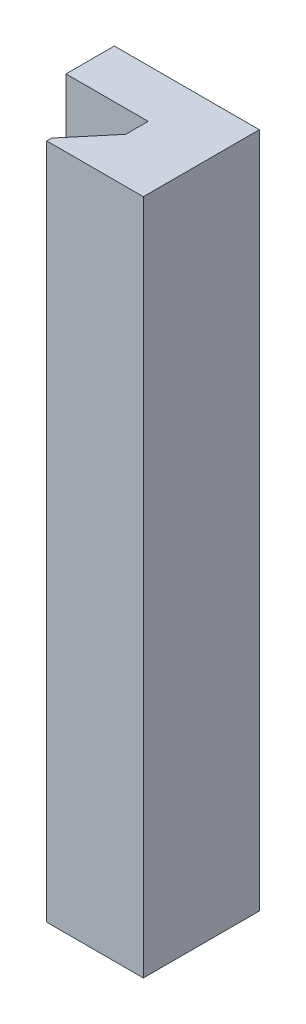
ISO-10303-21;
HEADER;
FILE_DESCRIPTION(('STEP AP214'),'2;1');
FILE_NAME('part.step','',(''),(''),'','','');
FILE_SCHEMA(('AUTOMOTIVE_DESIGN { 1 0 10303 214 1 1 1 1 }'));
ENDSEC;
DATA;
#1=APPLICATION_CONTEXT('core data for automotive mechanical design processes');
#2=APPLICATION_PROTOCOL_DEFINITION('international standard','automotive_design',2000,#1);
#3=PRODUCT_CONTEXT('',#1,'mechanical');
#4=PRODUCT('Part','Part','',(#3));
#5=PRODUCT_RELATED_PRODUCT_CATEGORY('part','',(#4));
#6=PRODUCT_DEFINITION_FORMATION('','',#4);
#7=PRODUCT_DEFINITION_CONTEXT('part definition',#1,'design');
#8=PRODUCT_DEFINITION('design','',#6,#7);
#9=PRODUCT_DEFINITION_SHAPE('','',#8);
#10=(LENGTH_UNIT() NAMED_UNIT(*) SI_UNIT(.MILLI.,.METRE.));
#11=(NAMED_UNIT(*) PLANE_ANGLE_UNIT() SI_UNIT($,.RADIAN.));
#12=(NAMED_UNIT(*) SI_UNIT($,.STERADIAN.) SOLID_ANGLE_UNIT());
#13=UNCERTAINTY_MEASURE_WITH_UNIT(LENGTH_MEASURE(1.E-05),#10,'distance_accuracy_value','');
#14=(GEOMETRIC_REPRESENTATION_CONTEXT(3) GLOBAL_UNCERTAINTY_ASSIGNED_CONTEXT((#13)) GLOBAL_UNIT_ASSIGNED_CONTEXT((#10,
#11,#12)) REPRESENTATION_CONTEXT('',''));
#15=CARTESIAN_POINT('',(0.,0.,0.));
#16=DIRECTION('',(0.,0.,1.));
#17=DIRECTION('',(1.,0.,0.));
#18=AXIS2_PLACEMENT_3D('',#15,#16,#17);
#19=CARTESIAN_POINT('',(0.,-70.,12.));
#20=DIRECTION('',(0.,1.,0.));
#21=DIRECTION('',(0.,0.,1.));
#22=AXIS2_PLACEMENT_3D('',#19,#20,#21);
#23=PLANE('',#22);
#24=DIRECTION('',(1.,0.,0.));
#25=VECTOR('',#24,1.);
#26=CARTESIAN_POINT('',(0.,-70.,5.));
#27=LINE('',#26,#25);
#28=CARTESIAN_POINT('',(20.,-70.,5.));
#29=VERTEX_POINT('',#28);
#30=CARTESIAN_POINT('',(28.5,-70.,5.));
#31=VERTEX_POINT('',#30);
#32=EDGE_CURVE('E114',#29,#31,#27,.T.);
#33=ORIENTED_EDGE('',*,*,#32,.F.);
#34=DIRECTION('',(0.,0.,1.));
#35=VECTOR('',#34,1.);
#36=CARTESIAN_POINT('',(20.,-70.,0.));
#37=LINE('',#36,#35);
#38=CARTESIAN_POINT('',(20.,-70.,0.));
#39=VERTEX_POINT('',#38);
#40=EDGE_CURVE('E51',#39,#29,#37,.T.);
#41=ORIENTED_EDGE('',*,*,#40,.F.);
#42=DIRECTION('',(1.,0.,0.));
#43=VECTOR('',#42,1.);
#44=CARTESIAN_POINT('',(0.,-70.,0.));
#45=LINE('',#44,#43);
#46=CARTESIAN_POINT('',(35.,-70.,0.));
#47=VERTEX_POINT('',#46);
#48=EDGE_CURVE('E112',#39,#47,#45,.T.);
#49=ORIENTED_EDGE('',*,*,#48,.T.);
#50=DIRECTION('',(0.,0.,-1.));
#51=VECTOR('',#50,1.);
#52=CARTESIAN_POINT('',(35.,-70.,12.));
#53=LINE('',#52,#51);
#54=CARTESIAN_POINT('',(35.,-70.,12.));
#55=VERTEX_POINT('',#54);
#56=EDGE_CURVE('E11',#55,#47,#53,.T.);
#57=ORIENTED_EDGE('',*,*,#56,.F.);
#58=DIRECTION('',(1.,0.,0.));
#59=VECTOR('',#58,1.);
#60=CARTESIAN_POINT('',(0.,-70.,12.));
#61=LINE('',#60,#59);
#62=CARTESIAN_POINT('',(25.,-70.,12.));
#63=VERTEX_POINT('',#62);
#64=EDGE_CURVE('E130',#63,#55,#61,.T.);
#65=ORIENTED_EDGE('',*,*,#64,.F.);
#66=DIRECTION('',(0.,0.,1.));
#67=VECTOR('',#66,1.);
#68=CARTESIAN_POINT('',(25.,-70.,12.));
#69=LINE('',#68,#67);
#70=CARTESIAN_POINT('',(25.,-70.,11.5));
#71=VERTEX_POINT('',#70);
#72=EDGE_CURVE('E59',#71,#63,#69,.T.);
#73=ORIENTED_EDGE('',*,*,#72,.F.);
#74=DIRECTION('',(-0.642787609686541,0.,0.766044443118977));
#75=VECTOR('',#74,1.);
#76=CARTESIAN_POINT('',(25.,-70.,11.5));
#77=LINE('',#76,#75);
#78=CARTESIAN_POINT('',(28.5,-70.,7.32886242592028));
#79=VERTEX_POINT('',#78);
#80=EDGE_CURVE('E150',#79,#71,#77,.T.);
#81=ORIENTED_EDGE('',*,*,#80,.F.);
#82=DIRECTION('',(0.,0.,1.));
#83=VECTOR('',#82,1.);
#84=CARTESIAN_POINT('',(28.5,-70.,7.32886242592028));
#85=LINE('',#84,#83);
#86=EDGE_CURVE('E153',#31,#79,#85,.T.);
#87=ORIENTED_EDGE('',*,*,#86,.F.);
#88=EDGE_LOOP('',(#33,#41,#49,#57,#65,#73,#81,#87));
#89=FACE_BOUND('',#88,.T.);
#90=ADVANCED_FACE('F37',(#89),#23,.F.);
#91=CARTESIAN_POINT('',(35.,0.,12.));
#92=DIRECTION('',(-1.,0.,0.));
#93=DIRECTION('',(0.,0.,1.));
#94=AXIS2_PLACEMENT_3D('',#91,#92,#93);
#95=PLANE('',#94);
#96=DIRECTION('',(0.,1.,0.));
#97=VECTOR('',#96,1.);
#98=CARTESIAN_POINT('',(35.,0.,0.));
#99=LINE('',#98,#97);
#100=CARTESIAN_POINT('',(35.,0.,0.));
#101=VERTEX_POINT('',#100);
#102=EDGE_CURVE('E118',#47,#101,#99,.T.);
#103=ORIENTED_EDGE('',*,*,#102,.T.);
#104=DIRECTION('',(0.,0.,-1.));
#105=VECTOR('',#104,1.);
#106=CARTESIAN_POINT('',(35.,0.,12.));
#107=LINE('',#106,#105);
#108=CARTESIAN_POINT('',(35.,0.,12.));
#109=VERTEX_POINT('',#108);
#110=EDGE_CURVE('E44',#109,#101,#107,.T.);
#111=ORIENTED_EDGE('',*,*,#110,.F.);
#112=DIRECTION('',(0.,1.,0.));
#113=VECTOR('',#112,1.);
#114=CARTESIAN_POINT('',(35.,0.,12.));
#115=LINE('',#114,#113);
#116=EDGE_CURVE('E136',#55,#109,#115,.T.);
#117=ORIENTED_EDGE('',*,*,#116,.F.);
#118=ORIENTED_EDGE('',*,*,#56,.T.);
#119=EDGE_LOOP('',(#103,#111,#117,#118));
#120=FACE_BOUND('',#119,.T.);
#121=ADVANCED_FACE('F183',(#120),#95,.F.);
#122=CARTESIAN_POINT('',(0.,0.,12.));
#123=DIRECTION('',(0.,-1.,0.));
#124=DIRECTION('',(0.,0.,-1.));
#125=AXIS2_PLACEMENT_3D('',#122,#123,#124);
#126=PLANE('',#125);
#127=DIRECTION('',(-1.,0.,0.));
#128=VECTOR('',#127,1.);
#129=CARTESIAN_POINT('',(0.,0.,0.));
#130=LINE('',#129,#128);
#131=CARTESIAN_POINT('',(20.,0.,0.));
#132=VERTEX_POINT('',#131);
#133=EDGE_CURVE('E121',#101,#132,#130,.T.);
#134=ORIENTED_EDGE('',*,*,#133,.T.);
#135=DIRECTION('',(0.,0.,1.));
#136=VECTOR('',#135,1.);
#137=CARTESIAN_POINT('',(20.,0.,0.));
#138=LINE('',#137,#136);
#139=CARTESIAN_POINT('',(20.,0.,5.));
#140=VERTEX_POINT('',#139);
#141=EDGE_CURVE('E102',#132,#140,#138,.T.);
#142=ORIENTED_EDGE('',*,*,#141,.T.);
#143=DIRECTION('',(-1.,0.,0.));
#144=VECTOR('',#143,1.);
#145=CARTESIAN_POINT('',(0.,0.,5.));
#146=LINE('',#145,#144);
#147=CARTESIAN_POINT('',(28.5,0.,5.));
#148=VERTEX_POINT('',#147);
#149=EDGE_CURVE('E119',#148,#140,#146,.T.);
#150=ORIENTED_EDGE('',*,*,#149,.F.);
#151=DIRECTION('',(0.,0.,-1.));
#152=VECTOR('',#151,1.);
#153=CARTESIAN_POINT('',(28.5,0.,7.32886242592028));
#154=LINE('',#153,#152);
#155=CARTESIAN_POINT('',(28.5,0.,7.32886242592028));
#156=VERTEX_POINT('',#155);
#157=EDGE_CURVE('E163',#156,#148,#154,.T.);
#158=ORIENTED_EDGE('',*,*,#157,.F.);
#159=DIRECTION('',(0.642787609686541,0.,-0.766044443118977));
#160=VECTOR('',#159,1.);
#161=CARTESIAN_POINT('',(25.,0.,11.5));
#162=LINE('',#161,#160);
#163=CARTESIAN_POINT('',(25.,0.,11.5));
#164=VERTEX_POINT('',#163);
#165=EDGE_CURVE('E160',#164,#156,#162,.T.);
#166=ORIENTED_EDGE('',*,*,#165,.F.);
#167=DIRECTION('',(0.,0.,-1.));
#168=VECTOR('',#167,1.);
#169=CARTESIAN_POINT('',(25.,0.,12.));
#170=LINE('',#169,#168);
#171=CARTESIAN_POINT('',(25.,0.,12.));
#172=VERTEX_POINT('',#171);
#173=EDGE_CURVE('E157',#172,#164,#170,.T.);
#174=ORIENTED_EDGE('',*,*,#173,.F.);
#175=DIRECTION('',(-1.,0.,0.));
#176=VECTOR('',#175,1.);
#177=CARTESIAN_POINT('',(0.,0.,12.));
#178=LINE('',#177,#176);
#179=EDGE_CURVE('E127',#109,#172,#178,.T.);
#180=ORIENTED_EDGE('',*,*,#179,.F.);
#181=ORIENTED_EDGE('',*,*,#110,.T.);
#182=EDGE_LOOP('',(#134,#142,#150,#158,#166,#174,#180,#181));
#183=FACE_BOUND('',#182,.T.);
#184=ADVANCED_FACE('F169',(#183),#126,.F.);
#185=CARTESIAN_POINT('',(0.,0.,12.));
#186=DIRECTION('',(0.,0.,1.));
#187=DIRECTION('',(1.,0.,0.));
#188=AXIS2_PLACEMENT_3D('',#185,#186,#187);
#189=PLANE('',#188);
#190=DIRECTION('',(0.,-1.,0.));
#191=VECTOR('',#190,1.);
#192=CARTESIAN_POINT('',(25.,0.001000000000001,12.));
#193=LINE('',#192,#191);
#194=EDGE_CURVE('E124',#172,#63,#193,.T.);
#195=ORIENTED_EDGE('',*,*,#194,.T.);
#196=ORIENTED_EDGE('',*,*,#64,.T.);
#197=ORIENTED_EDGE('',*,*,#116,.T.);
#198=ORIENTED_EDGE('',*,*,#179,.T.);
#199=EDGE_LOOP('',(#195,#196,#197,#198));
#200=FACE_BOUND('',#199,.T.);
#201=ADVANCED_FACE('F181',(#200),#189,.T.);
#202=CARTESIAN_POINT('',(0.,0.,0.));
#203=DIRECTION('',(0.,0.,1.));
#204=DIRECTION('',(1.,0.,0.));
#205=AXIS2_PLACEMENT_3D('',#202,#203,#204);
#206=PLANE('',#205);
#207=ORIENTED_EDGE('',*,*,#48,.F.);
#208=DIRECTION('',(0.,1.,0.));
#209=VECTOR('',#208,1.);
#210=CARTESIAN_POINT('',(20.,0.,0.));
#211=LINE('',#210,#209);
#212=EDGE_CURVE('E99',#39,#132,#211,.T.);
#213=ORIENTED_EDGE('',*,*,#212,.T.);
#214=ORIENTED_EDGE('',*,*,#133,.F.);
#215=ORIENTED_EDGE('',*,*,#102,.F.);
#216=EDGE_LOOP('',(#207,#213,#214,#215));
#217=FACE_BOUND('',#216,.T.);
#218=ADVANCED_FACE('F117',(#217),#206,.F.);
#219=CARTESIAN_POINT('',(25.,0.001000000000001,12.));
#220=DIRECTION('',(1.,0.,0.));
#221=DIRECTION('',(0.,0.,-1.));
#222=AXIS2_PLACEMENT_3D('',#219,#220,#221);
#223=PLANE('',#222);
#224=ORIENTED_EDGE('',*,*,#173,.T.);
#225=DIRECTION('',(0.,-1.,0.));
#226=VECTOR('',#225,1.);
#227=CARTESIAN_POINT('',(25.,0.001000000000001,11.5));
#228=LINE('',#227,#226);
#229=EDGE_CURVE('E146',#164,#71,#228,.T.);
#230=ORIENTED_EDGE('',*,*,#229,.T.);
#231=ORIENTED_EDGE('',*,*,#72,.T.);
#232=ORIENTED_EDGE('',*,*,#194,.F.);
#233=EDGE_LOOP('',(#224,#230,#231,#232));
#234=FACE_BOUND('',#233,.T.);
#235=ADVANCED_FACE('F179',(#234),#223,.F.);
#236=CARTESIAN_POINT('',(25.,0.001000000000001,11.5));
#237=DIRECTION('',(0.766044443118977,0.,0.642787609686541));
#238=DIRECTION('',(0.642787609686541,0.,-0.766044443118977));
#239=AXIS2_PLACEMENT_3D('',#236,#237,#238);
#240=PLANE('',#239);
#241=ORIENTED_EDGE('',*,*,#165,.T.);
#242=DIRECTION('',(0.,-1.,0.));
#243=VECTOR('',#242,1.);
#244=CARTESIAN_POINT('',(28.5,0.001000000000001,7.32886242592028));
#245=LINE('',#244,#243);
#246=EDGE_CURVE('E144',#156,#79,#245,.T.);
#247=ORIENTED_EDGE('',*,*,#246,.T.);
#248=ORIENTED_EDGE('',*,*,#80,.T.);
#249=ORIENTED_EDGE('',*,*,#229,.F.);
#250=EDGE_LOOP('',(#241,#247,#248,#249));
#251=FACE_BOUND('',#250,.T.);
#252=ADVANCED_FACE('F177',(#251),#240,.F.);
#253=CARTESIAN_POINT('',(28.5,0.001000000000001,7.32886242592028));
#254=DIRECTION('',(1.,0.,0.));
#255=DIRECTION('',(0.,0.,-1.));
#256=AXIS2_PLACEMENT_3D('',#253,#254,#255);
#257=PLANE('',#256);
#258=ORIENTED_EDGE('',*,*,#157,.T.);
#259=DIRECTION('',(0.,-1.,0.));
#260=VECTOR('',#259,1.);
#261=CARTESIAN_POINT('',(28.5,0.001000000000001,5.));
#262=LINE('',#261,#260);
#263=EDGE_CURVE('E141',#148,#31,#262,.T.);
#264=ORIENTED_EDGE('',*,*,#263,.T.);
#265=ORIENTED_EDGE('',*,*,#86,.T.);
#266=ORIENTED_EDGE('',*,*,#246,.F.);
#267=EDGE_LOOP('',(#258,#264,#265,#266));
#268=FACE_BOUND('',#267,.T.);
#269=ADVANCED_FACE('F173',(#268),#257,.F.);
#270=CARTESIAN_POINT('',(0.,0.001000000000001,5.));
#271=DIRECTION('',(0.,0.,-1.));
#272=DIRECTION('',(-1.,0.,0.));
#273=AXIS2_PLACEMENT_3D('',#270,#271,#272);
#274=PLANE('',#273);
#275=ORIENTED_EDGE('',*,*,#149,.T.);
#276=DIRECTION('',(0.,1.,0.));
#277=VECTOR('',#276,1.);
#278=CARTESIAN_POINT('',(20.,0.,5.));
#279=LINE('',#278,#277);
#280=EDGE_CURVE('E107',#29,#140,#279,.T.);
#281=ORIENTED_EDGE('',*,*,#280,.F.);
#282=ORIENTED_EDGE('',*,*,#32,.T.);
#283=ORIENTED_EDGE('',*,*,#263,.F.);
#284=EDGE_LOOP('',(#275,#281,#282,#283));
#285=FACE_BOUND('',#284,.T.);
#286=ADVANCED_FACE('F171',(#285),#274,.F.);
#287=CARTESIAN_POINT('',(20.,0.,0.));
#288=DIRECTION('',(1.,0.,0.));
#289=DIRECTION('',(0.,1.,0.));
#290=AXIS2_PLACEMENT_3D('',#287,#288,#289);
#291=PLANE('',#290);
#292=ORIENTED_EDGE('',*,*,#280,.T.);
#293=ORIENTED_EDGE('',*,*,#141,.F.);
#294=ORIENTED_EDGE('',*,*,#212,.F.);
#295=ORIENTED_EDGE('',*,*,#40,.T.);
#296=EDGE_LOOP('',(#292,#293,#294,#295));
#297=FACE_BOUND('',#296,.T.);
#298=ADVANCED_FACE('F100',(#297),#291,.F.);
#299=CLOSED_SHELL('',(#90,#121,#184,#201,#218,#235,#252,#269,#286,#298));
#300=MANIFOLD_SOLID_BREP('B2',#299);
#301=ADVANCED_BREP_SHAPE_REPRESENTATION('',(#18,#300),#14);
#302=SHAPE_DEFINITION_REPRESENTATION(#9,#301);
ENDSEC;
END-ISO-10303-21;
